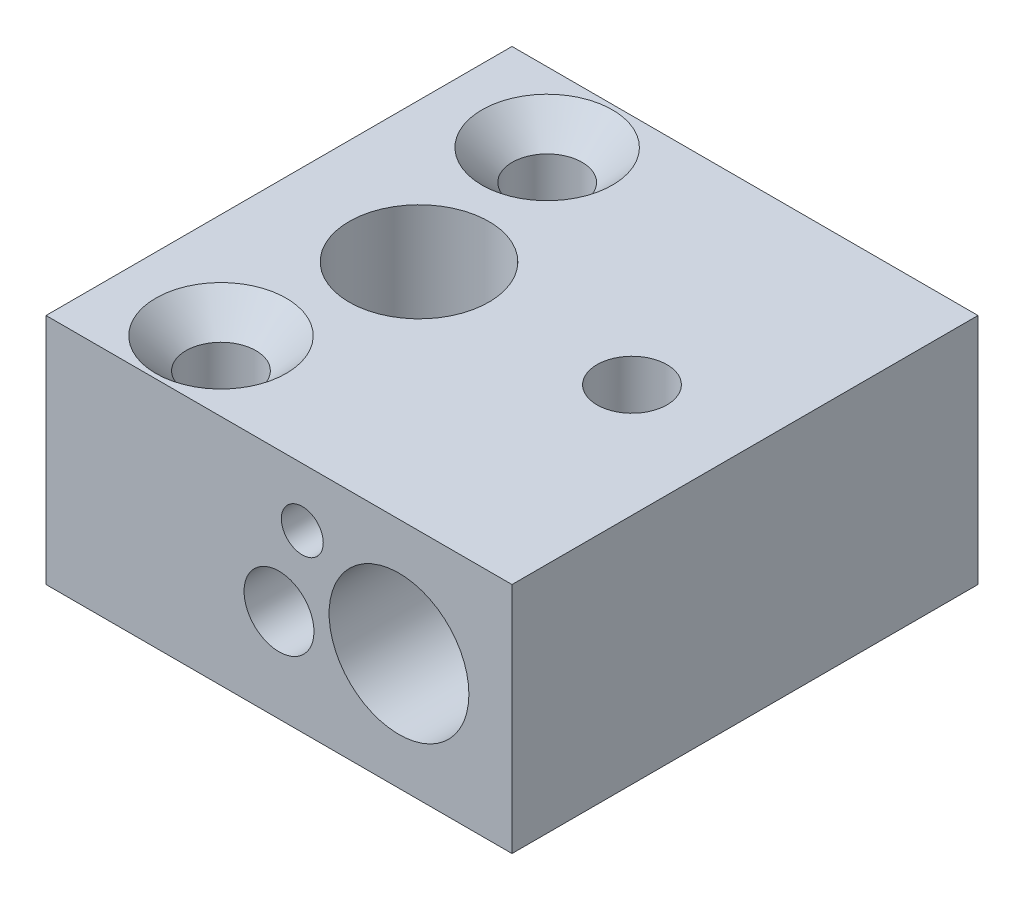
ISO-10303-21;
HEADER;
FILE_DESCRIPTION(('STEP AP214'),'2;1');
FILE_NAME('part.step','',(''),(''),'','','');
FILE_SCHEMA(('AUTOMOTIVE_DESIGN { 1 0 10303 214 1 1 1 1 }'));
ENDSEC;
DATA;
#1=APPLICATION_CONTEXT('core data for automotive mechanical design processes');
#2=APPLICATION_PROTOCOL_DEFINITION('international standard','automotive_design',2000,#1);
#3=PRODUCT_CONTEXT('',#1,'mechanical');
#4=PRODUCT('Part','Part','',(#3));
#5=PRODUCT_RELATED_PRODUCT_CATEGORY('part','',(#4));
#6=PRODUCT_DEFINITION_FORMATION('','',#4);
#7=PRODUCT_DEFINITION_CONTEXT('part definition',#1,'design');
#8=PRODUCT_DEFINITION('design','',#6,#7);
#9=PRODUCT_DEFINITION_SHAPE('','',#8);
#10=(LENGTH_UNIT() NAMED_UNIT(*) SI_UNIT(.MILLI.,.METRE.));
#11=(NAMED_UNIT(*) PLANE_ANGLE_UNIT() SI_UNIT($,.RADIAN.));
#12=(NAMED_UNIT(*) SI_UNIT($,.STERADIAN.) SOLID_ANGLE_UNIT());
#13=UNCERTAINTY_MEASURE_WITH_UNIT(LENGTH_MEASURE(1.E-05),#10,'distance_accuracy_value','');
#14=(GEOMETRIC_REPRESENTATION_CONTEXT(3) GLOBAL_UNCERTAINTY_ASSIGNED_CONTEXT((#13)) GLOBAL_UNIT_ASSIGNED_CONTEXT((#10,
#11,#12)) REPRESENTATION_CONTEXT('',''));
#15=CARTESIAN_POINT('',(0.,0.,0.));
#16=DIRECTION('',(0.,0.,1.));
#17=DIRECTION('',(1.,0.,0.));
#18=AXIS2_PLACEMENT_3D('',#15,#16,#17);
#19=CARTESIAN_POINT('',(0.,10.,0.));
#20=DIRECTION('',(1.,0.,0.));
#21=DIRECTION('',(0.,0.,-1.));
#22=AXIS2_PLACEMENT_3D('',#19,#20,#21);
#23=PLANE('',#22);
#24=DIRECTION('',(0.,0.,1.));
#25=VECTOR('',#24,1.);
#26=CARTESIAN_POINT('',(0.,0.,0.));
#27=LINE('',#26,#25);
#28=CARTESIAN_POINT('',(0.,0.,-20.));
#29=VERTEX_POINT('',#28);
#30=CARTESIAN_POINT('',(0.,0.,0.));
#31=VERTEX_POINT('',#30);
#32=EDGE_CURVE('E154',#29,#31,#27,.T.);
#33=ORIENTED_EDGE('',*,*,#32,.T.);
#34=DIRECTION('',(0.,-1.,0.));
#35=VECTOR('',#34,1.);
#36=CARTESIAN_POINT('',(0.,10.,0.));
#37=LINE('',#36,#35);
#38=CARTESIAN_POINT('',(0.,10.,0.));
#39=VERTEX_POINT('',#38);
#40=EDGE_CURVE('E11',#39,#31,#37,.T.);
#41=ORIENTED_EDGE('',*,*,#40,.F.);
#42=DIRECTION('',(0.,0.,1.));
#43=VECTOR('',#42,1.);
#44=CARTESIAN_POINT('',(0.,10.,0.));
#45=LINE('',#44,#43);
#46=CARTESIAN_POINT('',(0.,10.,-20.));
#47=VERTEX_POINT('',#46);
#48=EDGE_CURVE('E170',#47,#39,#45,.T.);
#49=ORIENTED_EDGE('',*,*,#48,.F.);
#50=DIRECTION('',(0.,-1.,0.));
#51=VECTOR('',#50,1.);
#52=CARTESIAN_POINT('',(0.,10.,-20.));
#53=LINE('',#52,#51);
#54=EDGE_CURVE('E156',#47,#29,#53,.T.);
#55=ORIENTED_EDGE('',*,*,#54,.T.);
#56=EDGE_LOOP('',(#33,#41,#49,#55));
#57=FACE_BOUND('',#56,.T.);
#58=ADVANCED_FACE('F36',(#57),#23,.F.);
#59=CARTESIAN_POINT('',(0.,10.,0.));
#60=DIRECTION('',(0.,0.,-1.));
#61=DIRECTION('',(-1.,0.,0.));
#62=AXIS2_PLACEMENT_3D('',#59,#60,#61);
#63=PLANE('',#62);
#64=CARTESIAN_POINT('',(11.,7.5,0.));
#65=DIRECTION('',(0.,0.,1.));
#66=DIRECTION('',(1.,0.,0.));
#67=AXIS2_PLACEMENT_3D('',#64,#65,#66);
#68=CIRCLE('',#67,0.9);
#69=CARTESIAN_POINT('',(11.9,7.5,0.));
#70=VERTEX_POINT('',#69);
#71=EDGE_CURVE('E101',#70,#70,#68,.T.);
#72=ORIENTED_EDGE('',*,*,#71,.F.);
#73=EDGE_LOOP('',(#72));
#74=FACE_BOUND('',#73,.T.);
#75=CARTESIAN_POINT('',(10.,4.,0.));
#76=DIRECTION('',(0.,0.,1.));
#77=DIRECTION('',(1.,0.,0.));
#78=AXIS2_PLACEMENT_3D('',#75,#76,#77);
#79=CIRCLE('',#78,1.49999999999999);
#80=CARTESIAN_POINT('',(11.5,4.,0.));
#81=VERTEX_POINT('',#80);
#82=EDGE_CURVE('E100',#81,#81,#79,.T.);
#83=ORIENTED_EDGE('',*,*,#82,.F.);
#84=EDGE_LOOP('',(#83));
#85=FACE_BOUND('',#84,.T.);
#86=CARTESIAN_POINT('',(15.15,5.,0.));
#87=DIRECTION('',(0.,0.,1.));
#88=DIRECTION('',(1.,0.,0.));
#89=AXIS2_PLACEMENT_3D('',#86,#87,#88);
#90=CIRCLE('',#89,2.99999999999999);
#91=CARTESIAN_POINT('',(18.15,5.,0.));
#92=VERTEX_POINT('',#91);
#93=EDGE_CURVE('E122',#92,#92,#90,.T.);
#94=ORIENTED_EDGE('',*,*,#93,.F.);
#95=EDGE_LOOP('',(#94));
#96=FACE_BOUND('',#95,.T.);
#97=DIRECTION('',(1.,0.,0.));
#98=VECTOR('',#97,1.);
#99=CARTESIAN_POINT('',(0.,0.,0.));
#100=LINE('',#99,#98);
#101=CARTESIAN_POINT('',(20.,0.,0.));
#102=VERTEX_POINT('',#101);
#103=EDGE_CURVE('E158',#31,#102,#100,.T.);
#104=ORIENTED_EDGE('',*,*,#103,.T.);
#105=DIRECTION('',(0.,-1.,0.));
#106=VECTOR('',#105,1.);
#107=CARTESIAN_POINT('',(20.,10.,0.));
#108=LINE('',#107,#106);
#109=CARTESIAN_POINT('',(20.,10.,0.));
#110=VERTEX_POINT('',#109);
#111=EDGE_CURVE('E44',#110,#102,#108,.T.);
#112=ORIENTED_EDGE('',*,*,#111,.F.);
#113=DIRECTION('',(1.,0.,0.));
#114=VECTOR('',#113,1.);
#115=CARTESIAN_POINT('',(0.,10.,0.));
#116=LINE('',#115,#114);
#117=EDGE_CURVE('E83',#39,#110,#116,.T.);
#118=ORIENTED_EDGE('',*,*,#117,.F.);
#119=ORIENTED_EDGE('',*,*,#40,.T.);
#120=EDGE_LOOP('',(#104,#112,#118,#119));
#121=FACE_BOUND('',#120,.T.);
#122=ADVANCED_FACE('F144',(#74,#85,#96,#121),#63,.F.);
#123=CARTESIAN_POINT('',(20.,10.,0.));
#124=DIRECTION('',(-1.,0.,0.));
#125=DIRECTION('',(0.,0.,1.));
#126=AXIS2_PLACEMENT_3D('',#123,#124,#125);
#127=PLANE('',#126);
#128=DIRECTION('',(0.,0.,-1.));
#129=VECTOR('',#128,1.);
#130=CARTESIAN_POINT('',(20.,0.,0.));
#131=LINE('',#130,#129);
#132=CARTESIAN_POINT('',(20.,0.,-20.));
#133=VERTEX_POINT('',#132);
#134=EDGE_CURVE('E70',#102,#133,#131,.T.);
#135=ORIENTED_EDGE('',*,*,#134,.T.);
#136=DIRECTION('',(0.,-1.,0.));
#137=VECTOR('',#136,1.);
#138=CARTESIAN_POINT('',(20.,10.,-20.));
#139=LINE('',#138,#137);
#140=CARTESIAN_POINT('',(20.,10.,-20.));
#141=VERTEX_POINT('',#140);
#142=EDGE_CURVE('E172',#141,#133,#139,.T.);
#143=ORIENTED_EDGE('',*,*,#142,.F.);
#144=DIRECTION('',(0.,0.,-1.));
#145=VECTOR('',#144,1.);
#146=CARTESIAN_POINT('',(20.,10.,0.));
#147=LINE('',#146,#145);
#148=EDGE_CURVE('E174',#110,#141,#147,.T.);
#149=ORIENTED_EDGE('',*,*,#148,.F.);
#150=ORIENTED_EDGE('',*,*,#111,.T.);
#151=EDGE_LOOP('',(#135,#143,#149,#150));
#152=FACE_BOUND('',#151,.T.);
#153=ADVANCED_FACE('F149',(#152),#127,.F.);
#154=CARTESIAN_POINT('',(0.,10.,-20.));
#155=DIRECTION('',(0.,0.,1.));
#156=DIRECTION('',(1.,0.,0.));
#157=AXIS2_PLACEMENT_3D('',#154,#155,#156);
#158=PLANE('',#157);
#159=CARTESIAN_POINT('',(15.15,5.,-20.));
#160=DIRECTION('',(0.,0.,1.));
#161=DIRECTION('',(1.,0.,0.));
#162=AXIS2_PLACEMENT_3D('',#159,#160,#161);
#163=CIRCLE('',#162,3.);
#164=CARTESIAN_POINT('',(18.15,5.,-20.));
#165=VERTEX_POINT('',#164);
#166=EDGE_CURVE('E338',#165,#165,#163,.T.);
#167=ORIENTED_EDGE('',*,*,#166,.T.);
#168=EDGE_LOOP('',(#167));
#169=FACE_BOUND('',#168,.T.);
#170=DIRECTION('',(-1.,0.,0.));
#171=VECTOR('',#170,1.);
#172=CARTESIAN_POINT('',(0.,0.,-20.));
#173=LINE('',#172,#171);
#174=EDGE_CURVE('E76',#133,#29,#173,.T.);
#175=ORIENTED_EDGE('',*,*,#174,.T.);
#176=ORIENTED_EDGE('',*,*,#54,.F.);
#177=DIRECTION('',(-1.,0.,0.));
#178=VECTOR('',#177,1.);
#179=CARTESIAN_POINT('',(0.,10.,-20.));
#180=LINE('',#179,#178);
#181=EDGE_CURVE('E52',#141,#47,#180,.T.);
#182=ORIENTED_EDGE('',*,*,#181,.F.);
#183=ORIENTED_EDGE('',*,*,#142,.T.);
#184=EDGE_LOOP('',(#175,#176,#182,#183));
#185=FACE_BOUND('',#184,.T.);
#186=ADVANCED_FACE('F188',(#169,#185),#158,.F.);
#187=CARTESIAN_POINT('',(0.,10.,0.));
#188=DIRECTION('',(0.,-1.,0.));
#189=DIRECTION('',(0.,0.,-1.));
#190=AXIS2_PLACEMENT_3D('',#187,#188,#189);
#191=PLANE('',#190);
#192=CARTESIAN_POINT('',(15.15,10.,-10.));
#193=DIRECTION('',(0.,1.,0.));
#194=DIRECTION('',(0.,0.,1.));
#195=AXIS2_PLACEMENT_3D('',#192,#193,#194);
#196=CIRCLE('',#195,1.5);
#197=CARTESIAN_POINT('',(15.15,10.,-8.5));
#198=VERTEX_POINT('',#197);
#199=EDGE_CURVE('E111',#198,#198,#196,.T.);
#200=ORIENTED_EDGE('',*,*,#199,.F.);
#201=EDGE_LOOP('',(#200));
#202=FACE_BOUND('',#201,.T.);
#203=CARTESIAN_POINT('',(4.51,10.,-3.));
#204=DIRECTION('',(0.,1.,0.));
#205=DIRECTION('',(0.,0.,1.));
#206=AXIS2_PLACEMENT_3D('',#203,#204,#205);
#207=CIRCLE('',#206,2.8);
#208=CARTESIAN_POINT('',(4.51,10.,-0.2));
#209=VERTEX_POINT('',#208);
#210=EDGE_CURVE('E336',#209,#209,#207,.T.);
#211=ORIENTED_EDGE('',*,*,#210,.F.);
#212=EDGE_LOOP('',(#211));
#213=FACE_BOUND('',#212,.T.);
#214=CARTESIAN_POINT('',(4.51,10.,-17.));
#215=DIRECTION('',(0.,1.,0.));
#216=DIRECTION('',(0.,0.,1.));
#217=AXIS2_PLACEMENT_3D('',#214,#215,#216);
#218=CIRCLE('',#217,2.8);
#219=CARTESIAN_POINT('',(4.51,10.,-14.2));
#220=VERTEX_POINT('',#219);
#221=EDGE_CURVE('E318',#220,#220,#218,.T.);
#222=ORIENTED_EDGE('',*,*,#221,.F.);
#223=EDGE_LOOP('',(#222));
#224=FACE_BOUND('',#223,.T.);
#225=CARTESIAN_POINT('',(6.01,10.,-10.));
#226=DIRECTION('',(0.,1.,0.));
#227=DIRECTION('',(0.,0.,1.));
#228=AXIS2_PLACEMENT_3D('',#225,#226,#227);
#229=CIRCLE('',#228,3.);
#230=CARTESIAN_POINT('',(6.01,10.,-7.));
#231=VERTEX_POINT('',#230);
#232=EDGE_CURVE('E163',#231,#231,#229,.T.);
#233=ORIENTED_EDGE('',*,*,#232,.F.);
#234=EDGE_LOOP('',(#233));
#235=FACE_BOUND('',#234,.T.);
#236=ORIENTED_EDGE('',*,*,#48,.T.);
#237=ORIENTED_EDGE('',*,*,#117,.T.);
#238=ORIENTED_EDGE('',*,*,#148,.T.);
#239=ORIENTED_EDGE('',*,*,#181,.T.);
#240=EDGE_LOOP('',(#236,#237,#238,#239));
#241=FACE_BOUND('',#240,.T.);
#242=ADVANCED_FACE('F178',(#202,#213,#224,#235,#241),#191,.F.);
#243=CARTESIAN_POINT('',(0.,0.,0.));
#244=DIRECTION('',(0.,-1.,0.));
#245=DIRECTION('',(0.,0.,-1.));
#246=AXIS2_PLACEMENT_3D('',#243,#244,#245);
#247=PLANE('',#246);
#248=CARTESIAN_POINT('',(4.51,0.,-3.));
#249=DIRECTION('',(0.,1.,0.));
#250=DIRECTION('',(0.,0.,1.));
#251=AXIS2_PLACEMENT_3D('',#248,#249,#250);
#252=CIRCLE('',#251,1.5);
#253=CARTESIAN_POINT('',(4.51,0.,-1.5));
#254=VERTEX_POINT('',#253);
#255=EDGE_CURVE('E322',#254,#254,#252,.T.);
#256=ORIENTED_EDGE('',*,*,#255,.T.);
#257=EDGE_LOOP('',(#256));
#258=FACE_BOUND('',#257,.T.);
#259=CARTESIAN_POINT('',(4.51,0.,-17.));
#260=DIRECTION('',(0.,1.,0.));
#261=DIRECTION('',(0.,0.,1.));
#262=AXIS2_PLACEMENT_3D('',#259,#260,#261);
#263=CIRCLE('',#262,1.5);
#264=CARTESIAN_POINT('',(4.51,0.,-15.5));
#265=VERTEX_POINT('',#264);
#266=EDGE_CURVE('E314',#265,#265,#263,.T.);
#267=ORIENTED_EDGE('',*,*,#266,.T.);
#268=EDGE_LOOP('',(#267));
#269=FACE_BOUND('',#268,.T.);
#270=CARTESIAN_POINT('',(6.01,0.,-10.));
#271=DIRECTION('',(0.,1.,0.));
#272=DIRECTION('',(0.,0.,1.));
#273=AXIS2_PLACEMENT_3D('',#270,#271,#272);
#274=CIRCLE('',#273,3.);
#275=CARTESIAN_POINT('',(6.01,0.,-7.));
#276=VERTEX_POINT('',#275);
#277=EDGE_CURVE('E159',#276,#276,#274,.T.);
#278=ORIENTED_EDGE('',*,*,#277,.T.);
#279=EDGE_LOOP('',(#278));
#280=FACE_BOUND('',#279,.T.);
#281=ORIENTED_EDGE('',*,*,#32,.F.);
#282=ORIENTED_EDGE('',*,*,#174,.F.);
#283=ORIENTED_EDGE('',*,*,#134,.F.);
#284=ORIENTED_EDGE('',*,*,#103,.F.);
#285=EDGE_LOOP('',(#281,#282,#283,#284));
#286=FACE_BOUND('',#285,.T.);
#287=ADVANCED_FACE('F175',(#258,#269,#280,#286),#247,.T.);
#288=CARTESIAN_POINT('',(6.01,10.,-10.));
#289=DIRECTION('',(0.,1.,0.));
#290=DIRECTION('',(0.,0.,1.));
#291=AXIS2_PLACEMENT_3D('',#288,#289,#290);
#292=CYLINDRICAL_SURFACE('',#291,3.);
#293=ORIENTED_EDGE('',*,*,#277,.F.);
#294=EDGE_LOOP('',(#293));
#295=FACE_BOUND('',#294,.T.);
#296=ORIENTED_EDGE('',*,*,#232,.T.);
#297=EDGE_LOOP('',(#296));
#298=FACE_BOUND('',#297,.T.);
#299=ADVANCED_FACE('F177',(#295,#298),#292,.F.);
#300=CARTESIAN_POINT('',(4.51,10.,-17.));
#301=DIRECTION('',(0.,1.,0.));
#302=DIRECTION('',(0.,0.,1.));
#303=AXIS2_PLACEMENT_3D('',#300,#301,#302);
#304=CYLINDRICAL_SURFACE('',#303,1.5);
#305=ORIENTED_EDGE('',*,*,#266,.F.);
#306=EDGE_LOOP('',(#305));
#307=FACE_BOUND('',#306,.T.);
#308=CARTESIAN_POINT('',(4.51,8.7,-17.));
#309=DIRECTION('',(0.,1.,0.));
#310=DIRECTION('',(0.,0.,1.));
#311=AXIS2_PLACEMENT_3D('',#308,#309,#310);
#312=CIRCLE('',#311,1.5);
#313=CARTESIAN_POINT('',(4.51,8.7,-15.5));
#314=VERTEX_POINT('',#313);
#315=EDGE_CURVE('E317',#314,#314,#312,.T.);
#316=ORIENTED_EDGE('',*,*,#315,.T.);
#317=EDGE_LOOP('',(#316));
#318=FACE_BOUND('',#317,.T.);
#319=ADVANCED_FACE('F185',(#307,#318),#304,.F.);
#320=CARTESIAN_POINT('',(4.51,10.,-17.));
#321=DIRECTION('',(0.,1.,0.));
#322=DIRECTION('',(0.,0.,1.));
#323=AXIS2_PLACEMENT_3D('',#320,#321,#322);
#324=CONICAL_SURFACE('',#323,2.8,0.785398163397448);
#325=ORIENTED_EDGE('',*,*,#315,.F.);
#326=EDGE_LOOP('',(#325));
#327=FACE_BOUND('',#326,.T.);
#328=ORIENTED_EDGE('',*,*,#221,.T.);
#329=EDGE_LOOP('',(#328));
#330=FACE_BOUND('',#329,.T.);
#331=ADVANCED_FACE('F277',(#327,#330),#324,.F.);
#332=CARTESIAN_POINT('',(4.51,10.,-3.));
#333=DIRECTION('',(0.,1.,0.));
#334=DIRECTION('',(0.,0.,1.));
#335=AXIS2_PLACEMENT_3D('',#332,#333,#334);
#336=CYLINDRICAL_SURFACE('',#335,1.5);
#337=ORIENTED_EDGE('',*,*,#255,.F.);
#338=EDGE_LOOP('',(#337));
#339=FACE_BOUND('',#338,.T.);
#340=CARTESIAN_POINT('',(4.51,8.7,-3.));
#341=DIRECTION('',(0.,1.,0.));
#342=DIRECTION('',(0.,0.,1.));
#343=AXIS2_PLACEMENT_3D('',#340,#341,#342);
#344=CIRCLE('',#343,1.5);
#345=CARTESIAN_POINT('',(4.51,8.7,-1.5));
#346=VERTEX_POINT('',#345);
#347=EDGE_CURVE('E333',#346,#346,#344,.T.);
#348=ORIENTED_EDGE('',*,*,#347,.T.);
#349=EDGE_LOOP('',(#348));
#350=FACE_BOUND('',#349,.T.);
#351=ADVANCED_FACE('F270',(#339,#350),#336,.F.);
#352=CARTESIAN_POINT('',(4.51,10.,-3.));
#353=DIRECTION('',(0.,1.,0.));
#354=DIRECTION('',(0.,0.,1.));
#355=AXIS2_PLACEMENT_3D('',#352,#353,#354);
#356=CONICAL_SURFACE('',#355,2.8,0.785398163397448);
#357=ORIENTED_EDGE('',*,*,#347,.F.);
#358=EDGE_LOOP('',(#357));
#359=FACE_BOUND('',#358,.T.);
#360=ORIENTED_EDGE('',*,*,#210,.T.);
#361=EDGE_LOOP('',(#360));
#362=FACE_BOUND('',#361,.T.);
#363=ADVANCED_FACE('F222',(#359,#362),#356,.F.);
#364=CARTESIAN_POINT('',(15.15,5.,0.));
#365=DIRECTION('',(0.,0.,1.));
#366=DIRECTION('',(1.,0.,0.));
#367=AXIS2_PLACEMENT_3D('',#364,#365,#366);
#368=CYLINDRICAL_SURFACE('',#367,2.99999999999999);
#369=CARTESIAN_POINT('',(15.15,7.99999999999999,-8.5));
#370=CARTESIAN_POINT('',(15.2288579444269,7.99999570107561,-8.50000495347579));
#371=CARTESIAN_POINT('',(15.3078098995463,7.99685736529634,-8.50625510968159));
#372=CARTESIAN_POINT('',(15.4633803529033,7.98461234055735,-8.53097932051231));
#373=CARTESIAN_POINT('',(15.5399941300704,7.97549431743379,-8.54947658949673));
#374=CARTESIAN_POINT('',(15.6884003173207,7.95224419105062,-8.59779071292495));
#375=CARTESIAN_POINT('',(15.7602102044087,7.93813158766305,-8.62756357637195));
#376=CARTESIAN_POINT('',(15.8977089252099,7.90618664773641,-8.69735593204748));
#377=CARTESIAN_POINT('',(15.9633982409851,7.88835460450287,-8.7373746163733));
#378=CARTESIAN_POINT('',(16.0912617266429,7.84934387387092,-8.82927587422793));
#379=CARTESIAN_POINT('',(16.1529828166832,7.82802798691305,-8.88172971885946));
#380=CARTESIAN_POINT('',(16.2671691673005,7.78489955370114,-8.99578221887056));
#381=CARTESIAN_POINT('',(16.3196273746601,7.76308664313551,-9.05738777765866));
#382=CARTESIAN_POINT('',(16.4178780006754,7.7194842679602,-9.19372502428507));
#383=CARTESIAN_POINT('',(16.4628380033275,7.69782780455197,-9.26910414751887));
#384=CARTESIAN_POINT('',(16.539252340336,7.6592896815848,-9.42755100397932));
#385=CARTESIAN_POINT('',(16.5707163224495,7.64240461410484,-9.51061319308413));
#386=CARTESIAN_POINT('',(16.6171986632829,7.61686800556712,-9.67699765813289));
#387=CARTESIAN_POINT('',(16.6330887856207,7.60778407375569,-9.76000667810109));
#388=CARTESIAN_POINT('',(16.6506404899633,7.59772834922791,-9.92796825666921));
#389=CARTESIAN_POINT('',(16.6523161325596,7.59674854014931,-10.0129188113067));
#390=CARTESIAN_POINT('',(16.6420309307584,7.60266395385872,-10.1714290364731));
#391=CARTESIAN_POINT('',(16.6316768393052,7.6086314549302,-10.2451360468346));
#392=CARTESIAN_POINT('',(16.6004097735854,7.62614343100775,-10.3895828640596));
#393=CARTESIAN_POINT('',(16.5794934358465,7.63768968247664,-10.460321717958));
#394=CARTESIAN_POINT('',(16.527314670579,7.66531214619111,-10.5988436988485));
#395=CARTESIAN_POINT('',(16.495822600674,7.68148760995997,-10.6665195981787));
#396=CARTESIAN_POINT('',(16.423562531502,7.71655106422105,-10.795951438885));
#397=CARTESIAN_POINT('',(16.3827903657187,7.73544027170285,-10.8577047034001));
#398=CARTESIAN_POINT('',(16.2870990823692,7.77669736854928,-10.9817818791148));
#399=CARTESIAN_POINT('',(16.2310416875539,7.79920265355118,-11.0431853103642));
#400=CARTESIAN_POINT('',(16.1093333681121,7.8432143495061,-11.1561031278864));
#401=CARTESIAN_POINT('',(16.0436778848614,7.86472027938201,-11.2076127880508));
#402=CARTESIAN_POINT('',(15.9007747587478,7.90552980924445,-11.3015284915446));
#403=CARTESIAN_POINT('',(15.8231303873991,7.9246847624301,-11.3434007086686));
#404=CARTESIAN_POINT('',(15.6606993232332,7.95736821681863,-11.4131455435645));
#405=CARTESIAN_POINT('',(15.5759183643979,7.97090118415329,-11.4410292775227));
#406=CARTESIAN_POINT('',(15.4091497374911,7.98986500612153,-11.479713105575));
#407=CARTESIAN_POINT('',(15.3275122958225,7.99587407451964,-11.4917368536202));
#408=CARTESIAN_POINT('',(15.163169399924,8.00109520188655,-11.5021970967017));
#409=CARTESIAN_POINT('',(15.0804644701951,8.00031048081977,-11.5006400284592));
#410=CARTESIAN_POINT('',(14.923150542021,7.99236788380152,-11.4846899673719));
#411=CARTESIAN_POINT('',(14.8484108879251,7.98570868532252,-11.471301200905));
#412=CARTESIAN_POINT('',(14.7023896615471,7.9673325697226,-11.4336428921573));
#413=CARTESIAN_POINT('',(14.6311084714634,7.95561509501617,-11.4093721503198));
#414=CARTESIAN_POINT('',(14.4916670873256,7.92776377120381,-11.3500023003505));
#415=CARTESIAN_POINT('',(14.4236544044913,7.91151322654446,-11.3146134248256));
#416=CARTESIAN_POINT('',(14.2943079574511,7.87615961476126,-11.2343386965301));
#417=CARTESIAN_POINT('',(14.2329770553351,7.85705533350407,-11.1894487981069));
#418=CARTESIAN_POINT('',(14.1123484660662,7.81562332004296,-11.0863593620039));
#419=CARTESIAN_POINT('',(14.0538418832715,7.79316327265248,-11.0272856973323));
#420=CARTESIAN_POINT('',(13.9472155183217,7.74893587413229,-10.9001122730834));
#421=CARTESIAN_POINT('',(13.8991029214322,7.7271690110007,-10.8320063217281));
#422=CARTESIAN_POINT('',(13.8124381282815,7.68576788309733,-10.6845345187405));
#423=CARTESIAN_POINT('',(13.7744617562996,7.6662879438359,-10.6047831008583));
#424=CARTESIAN_POINT('',(13.7128757610979,7.63361108441201,-10.4387348986376));
#425=CARTESIAN_POINT('',(13.6892476261995,7.62040607332624,-10.3524467102997));
#426=CARTESIAN_POINT('',(13.6592074687997,7.60342251538702,-10.1846346656729));
#427=CARTESIAN_POINT('',(13.6513605053918,7.59886075197597,-10.1034486198471));
#428=CARTESIAN_POINT('',(13.6489662684357,7.59748031962404,-9.94082939925321));
#429=CARTESIAN_POINT('',(13.6544132300651,7.60065829439584,-9.85939634689321));
#430=CARTESIAN_POINT('',(13.67711081161,7.61356793076614,-9.70677474769985));
#431=CARTESIAN_POINT('',(13.6931875284855,7.62264641723987,-9.63534929478289));
#432=CARTESIAN_POINT('',(13.7352369626634,7.64556524281478,-9.49628782086345));
#433=CARTESIAN_POINT('',(13.7612128632601,7.65940711354502,-9.42865302686196));
#434=CARTESIAN_POINT('',(13.8242763820492,7.69142795546803,-9.2940627235202));
#435=CARTESIAN_POINT('',(13.8619932932765,7.7098358359388,-9.22745814725646));
#436=CARTESIAN_POINT('',(13.9467735425439,7.7485299745229,-9.10108819572812));
#437=CARTESIAN_POINT('',(13.9938417431377,7.76881720693415,-9.04132640421833));
#438=CARTESIAN_POINT('',(14.1026950100079,7.81193484737137,-8.92278702646799));
#439=CARTESIAN_POINT('',(14.1655733655041,7.83477474959941,-8.86501134647457));
#440=CARTESIAN_POINT('',(14.3007677906502,7.87816628389895,-8.7606055248471));
#441=CARTESIAN_POINT('',(14.3730889150422,7.89871667939292,-8.71398139079515));
#442=CARTESIAN_POINT('',(14.5261026048256,7.93547014349805,-8.6331454559319));
#443=CARTESIAN_POINT('',(14.6068507443349,7.95164144740899,-8.5990237461453));
#444=CARTESIAN_POINT('',(14.7738868482929,7.9775201194848,-8.54528774836389));
#445=CARTESIAN_POINT('',(14.8601583006163,7.98724585044601,-8.52563222979143));
#446=CARTESIAN_POINT('',(14.9810970802637,7.99543192870216,-8.50915388337139));
#447=CARTESIAN_POINT('',(15.0147571808377,7.99714048010375,-8.50572603870049));
#448=CARTESIAN_POINT('',(15.0822724022924,7.99942545465222,-8.50114800172888));
#449=CARTESIAN_POINT('',(15.1161275285301,8.00000184655071,-8.49999787229469));
#450=CARTESIAN_POINT('',(15.15,7.99999999999999,-8.5));
#451=B_SPLINE_CURVE_WITH_KNOTS('',3,(#369,#370,#371,#372,#373,#374,#375,#376,#377,#378,#379,
#380,#381,#382,#383,#384,#385,#386,#387,#388,#389,#390,#391,#392,#393,#394,#395,#396,#397,#398,
#399,#400,#401,#402,#403,#404,#405,#406,#407,#408,#409,#410,#411,#412,#413,#414,#415,#416,#417,
#418,#419,#420,#421,#422,#423,#424,#425,#426,#427,#428,#429,#430,#431,#432,#433,#434,#435,#436,
#437,#438,#439,#440,#441,#442,#443,#444,#445,#446,#447,#448,#449,#450),.UNSPECIFIED.,.T.,.F.,(4,
2,2,2,2,2,2,2,2,2,2,2,2,2,2,2,2,2,2,2,2,2,2,2,2,2,2,2,2,2,2,2,2,2,2,2,2,2,2,2,4),(0.,
0.236436386130439,0.473322224563795,0.709293233238445,0.945245640872353,1.19547263807713,
1.44588935648105,1.71572589646129,1.98536921847421,2.23887018210344,2.4921203599353,
2.7150856861398,2.93812205888517,3.1663536025273,3.39468781890332,3.65197412000817,
3.90938301898029,4.1787453332166,4.44789325368419,4.69474935707018,4.94148846767213,
5.16910359759182,5.39674382446396,5.63089284041847,5.86514176122508,6.12239415966627,
6.37982382923147,6.64972023242587,6.91926767918175,7.16293961254569,7.40650589797016,
7.62686895373282,7.84730293182525,8.0825468517043,8.31791341715445,8.58187864135756,
8.84598575071867,9.11196020495288,9.37717362931722,9.47872920200874,9.58028757766598),.UNSPECIFIED.);
#452=CARTESIAN_POINT('',(15.15,7.99999999999999,-8.5));
#453=VERTEX_POINT('',#452);
#454=EDGE_CURVE('E114',#453,#453,#451,.T.);
#455=ORIENTED_EDGE('',*,*,#454,.T.);
#456=EDGE_LOOP('',(#455));
#457=FACE_BOUND('',#456,.T.);
#458=ORIENTED_EDGE('',*,*,#166,.F.);
#459=EDGE_LOOP('',(#458));
#460=FACE_BOUND('',#459,.T.);
#461=ORIENTED_EDGE('',*,*,#93,.T.);
#462=EDGE_LOOP('',(#461));
#463=FACE_BOUND('',#462,.T.);
#464=ADVANCED_FACE('F131',(#457,#460,#463),#368,.F.);
#465=CARTESIAN_POINT('',(15.15,10.,-10.));
#466=DIRECTION('',(0.,1.,0.));
#467=DIRECTION('',(0.,0.,1.));
#468=AXIS2_PLACEMENT_3D('',#465,#466,#467);
#469=CYLINDRICAL_SURFACE('',#468,1.5);
#470=ORIENTED_EDGE('',*,*,#454,.F.);
#471=EDGE_LOOP('',(#470));
#472=FACE_BOUND('',#471,.T.);
#473=ORIENTED_EDGE('',*,*,#199,.T.);
#474=EDGE_LOOP('',(#473));
#475=FACE_BOUND('',#474,.T.);
#476=ADVANCED_FACE('F126',(#472,#475),#469,.F.);
#477=CARTESIAN_POINT('',(10.,4.,-6.));
#478=DIRECTION('',(0.,0.,1.));
#479=DIRECTION('',(1.,0.,0.));
#480=AXIS2_PLACEMENT_3D('',#477,#478,#479);
#481=CONICAL_SURFACE('',#480,1.5,1.02974425867665);
#482=CARTESIAN_POINT('',(10.,4.,-6.90129092854134));
#483=VERTEX_POINT('',#482);
#484=VERTEX_LOOP('',#483);
#485=FACE_BOUND('',#484,.T.);
#486=CARTESIAN_POINT('',(10.,4.,-6.));
#487=DIRECTION('',(0.,0.,1.));
#488=DIRECTION('',(1.,0.,0.));
#489=AXIS2_PLACEMENT_3D('',#486,#487,#488);
#490=CIRCLE('',#489,1.5);
#491=CARTESIAN_POINT('',(11.5,4.,-6.));
#492=VERTEX_POINT('',#491);
#493=EDGE_CURVE('E104',#492,#492,#490,.T.);
#494=ORIENTED_EDGE('',*,*,#493,.T.);
#495=EDGE_LOOP('',(#494));
#496=FACE_BOUND('',#495,.T.);
#497=ADVANCED_FACE('F130',(#485,#496),#481,.F.);
#498=CARTESIAN_POINT('',(10.,4.,0.));
#499=DIRECTION('',(0.,0.,1.));
#500=DIRECTION('',(1.,0.,0.));
#501=AXIS2_PLACEMENT_3D('',#498,#499,#500);
#502=CYLINDRICAL_SURFACE('',#501,1.49999999999999);
#503=ORIENTED_EDGE('',*,*,#493,.F.);
#504=EDGE_LOOP('',(#503));
#505=FACE_BOUND('',#504,.T.);
#506=ORIENTED_EDGE('',*,*,#82,.T.);
#507=EDGE_LOOP('',(#506));
#508=FACE_BOUND('',#507,.T.);
#509=ADVANCED_FACE('F94',(#505,#508),#502,.F.);
#510=CARTESIAN_POINT('',(11.,7.5,-4.));
#511=DIRECTION('',(0.,0.,1.));
#512=DIRECTION('',(1.,0.,0.));
#513=AXIS2_PLACEMENT_3D('',#510,#511,#512);
#514=CONICAL_SURFACE('',#513,0.899999999999998,1.02974425867665);
#515=CARTESIAN_POINT('',(11.,7.5,-4.5407745571248));
#516=VERTEX_POINT('',#515);
#517=VERTEX_LOOP('',#516);
#518=FACE_BOUND('',#517,.T.);
#519=CARTESIAN_POINT('',(11.,7.5,-4.));
#520=DIRECTION('',(0.,0.,1.));
#521=DIRECTION('',(1.,0.,0.));
#522=AXIS2_PLACEMENT_3D('',#519,#520,#521);
#523=CIRCLE('',#522,0.899999999999998);
#524=CARTESIAN_POINT('',(11.9,7.5,-4.));
#525=VERTEX_POINT('',#524);
#526=EDGE_CURVE('E98',#525,#525,#523,.T.);
#527=ORIENTED_EDGE('',*,*,#526,.T.);
#528=EDGE_LOOP('',(#527));
#529=FACE_BOUND('',#528,.T.);
#530=ADVANCED_FACE('F90',(#518,#529),#514,.F.);
#531=CARTESIAN_POINT('',(11.,7.5,0.));
#532=DIRECTION('',(0.,0.,1.));
#533=DIRECTION('',(1.,0.,0.));
#534=AXIS2_PLACEMENT_3D('',#531,#532,#533);
#535=CYLINDRICAL_SURFACE('',#534,0.899999999999999);
#536=ORIENTED_EDGE('',*,*,#526,.F.);
#537=EDGE_LOOP('',(#536));
#538=FACE_BOUND('',#537,.T.);
#539=ORIENTED_EDGE('',*,*,#71,.T.);
#540=EDGE_LOOP('',(#539));
#541=FACE_BOUND('',#540,.T.);
#542=ADVANCED_FACE('F93',(#538,#541),#535,.F.);
#543=CLOSED_SHELL('',(#58,#122,#153,#186,#242,#287,#299,#319,#331,#351,#363,#464,#476,#497,#509,
#530,#542));
#544=MANIFOLD_SOLID_BREP('B2',#543);
#545=ADVANCED_BREP_SHAPE_REPRESENTATION('',(#18,#544),#14);
#546=SHAPE_DEFINITION_REPRESENTATION(#9,#545);
ENDSEC;
END-ISO-10303-21;
